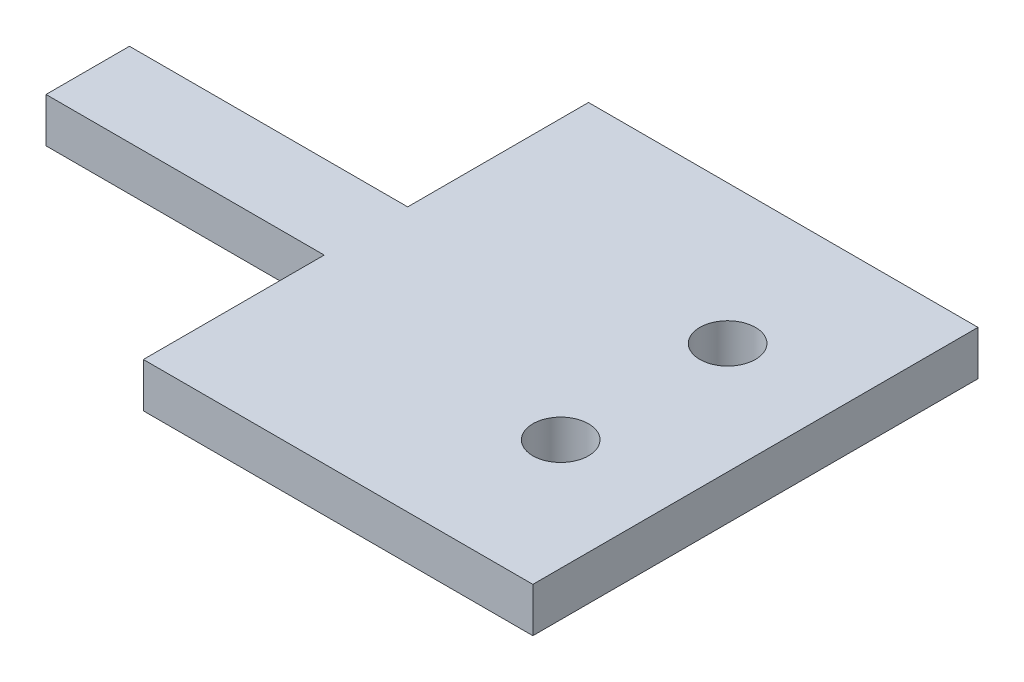
ISO-10303-21;
HEADER;
FILE_DESCRIPTION(('STEP AP214'),'2;1');
FILE_NAME('part.step','',(''),(''),'','','');
FILE_SCHEMA(('AUTOMOTIVE_DESIGN { 1 0 10303 214 1 1 1 1 }'));
ENDSEC;
DATA;
#1=APPLICATION_CONTEXT('core data for automotive mechanical design processes');
#2=APPLICATION_PROTOCOL_DEFINITION('international standard','automotive_design',2000,#1);
#3=PRODUCT_CONTEXT('',#1,'mechanical');
#4=PRODUCT('Part','Part','',(#3));
#5=PRODUCT_RELATED_PRODUCT_CATEGORY('part','',(#4));
#6=PRODUCT_DEFINITION_FORMATION('','',#4);
#7=PRODUCT_DEFINITION_CONTEXT('part definition',#1,'design');
#8=PRODUCT_DEFINITION('design','',#6,#7);
#9=PRODUCT_DEFINITION_SHAPE('','',#8);
#10=(LENGTH_UNIT() NAMED_UNIT(*) SI_UNIT(.MILLI.,.METRE.));
#11=(NAMED_UNIT(*) PLANE_ANGLE_UNIT() SI_UNIT($,.RADIAN.));
#12=(NAMED_UNIT(*) SI_UNIT($,.STERADIAN.) SOLID_ANGLE_UNIT());
#13=UNCERTAINTY_MEASURE_WITH_UNIT(LENGTH_MEASURE(1.E-05),#10,'distance_accuracy_value','');
#14=(GEOMETRIC_REPRESENTATION_CONTEXT(3) GLOBAL_UNCERTAINTY_ASSIGNED_CONTEXT((#13)) GLOBAL_UNIT_ASSIGNED_CONTEXT((#10,
#11,#12)) REPRESENTATION_CONTEXT('',''));
#15=CARTESIAN_POINT('',(0.,0.,0.));
#16=DIRECTION('',(0.,0.,1.));
#17=DIRECTION('',(1.,0.,0.));
#18=AXIS2_PLACEMENT_3D('',#15,#16,#17);
#19=CARTESIAN_POINT('',(0.,8.,0.));
#20=DIRECTION('',(0.,1.,0.));
#21=DIRECTION('',(0.,0.,1.));
#22=AXIS2_PLACEMENT_3D('',#19,#20,#21);
#23=PLANE('',#22);
#24=CARTESIAN_POINT('',(40.,8.,-15.));
#25=DIRECTION('',(0.,1.,0.));
#26=DIRECTION('',(0.,0.,1.));
#27=AXIS2_PLACEMENT_3D('',#24,#25,#26);
#28=CIRCLE('',#27,5.);
#29=CARTESIAN_POINT('',(40.,8.,-10.));
#30=VERTEX_POINT('',#29);
#31=EDGE_CURVE('E136',#30,#30,#28,.T.);
#32=ORIENTED_EDGE('',*,*,#31,.F.);
#33=EDGE_LOOP('',(#32));
#34=FACE_BOUND('',#33,.T.);
#35=DIRECTION('',(-1.,0.,0.));
#36=VECTOR('',#35,1.);
#37=CARTESIAN_POINT('',(-10.,8.,-40.));
#38=LINE('',#37,#36);
#39=CARTESIAN_POINT('',(60.,8.,-40.));
#40=VERTEX_POINT('',#39);
#41=CARTESIAN_POINT('',(-10.,8.,-40.));
#42=VERTEX_POINT('',#41);
#43=EDGE_CURVE('E147',#40,#42,#38,.T.);
#44=ORIENTED_EDGE('',*,*,#43,.T.);
#45=DIRECTION('',(0.,0.,1.));
#46=VECTOR('',#45,1.);
#47=CARTESIAN_POINT('',(-10.,8.,-7.5));
#48=LINE('',#47,#46);
#49=CARTESIAN_POINT('',(-10.,8.,-7.5));
#50=VERTEX_POINT('',#49);
#51=EDGE_CURVE('E95',#42,#50,#48,.T.);
#52=ORIENTED_EDGE('',*,*,#51,.T.);
#53=DIRECTION('',(-1.,0.,0.));
#54=VECTOR('',#53,1.);
#55=CARTESIAN_POINT('',(-60.,8.,-7.5));
#56=LINE('',#55,#54);
#57=CARTESIAN_POINT('',(-60.,8.,-7.5));
#58=VERTEX_POINT('',#57);
#59=EDGE_CURVE('E162',#50,#58,#56,.T.);
#60=ORIENTED_EDGE('',*,*,#59,.T.);
#61=DIRECTION('',(0.,0.,1.));
#62=VECTOR('',#61,1.);
#63=CARTESIAN_POINT('',(-60.,8.,-7.5));
#64=LINE('',#63,#62);
#65=CARTESIAN_POINT('',(-60.,8.,7.5));
#66=VERTEX_POINT('',#65);
#67=EDGE_CURVE('E175',#58,#66,#64,.T.);
#68=ORIENTED_EDGE('',*,*,#67,.T.);
#69=DIRECTION('',(1.,0.,0.));
#70=VECTOR('',#69,1.);
#71=CARTESIAN_POINT('',(-60.,8.,7.5));
#72=LINE('',#71,#70);
#73=CARTESIAN_POINT('',(-10.,8.,7.5));
#74=VERTEX_POINT('',#73);
#75=EDGE_CURVE('E114',#66,#74,#72,.T.);
#76=ORIENTED_EDGE('',*,*,#75,.T.);
#77=DIRECTION('',(0.,0.,1.));
#78=VECTOR('',#77,1.);
#79=CARTESIAN_POINT('',(-10.,8.,40.));
#80=LINE('',#79,#78);
#81=CARTESIAN_POINT('',(-10.,8.,40.));
#82=VERTEX_POINT('',#81);
#83=EDGE_CURVE('E108',#74,#82,#80,.T.);
#84=ORIENTED_EDGE('',*,*,#83,.T.);
#85=DIRECTION('',(1.,0.,0.));
#86=VECTOR('',#85,1.);
#87=CARTESIAN_POINT('',(60.,8.,40.));
#88=LINE('',#87,#86);
#89=CARTESIAN_POINT('',(60.,8.,40.));
#90=VERTEX_POINT('',#89);
#91=EDGE_CURVE('E112',#82,#90,#88,.T.);
#92=ORIENTED_EDGE('',*,*,#91,.T.);
#93=DIRECTION('',(0.,0.,-1.));
#94=VECTOR('',#93,1.);
#95=CARTESIAN_POINT('',(60.,8.,40.));
#96=LINE('',#95,#94);
#97=EDGE_CURVE('E52',#90,#40,#96,.T.);
#98=ORIENTED_EDGE('',*,*,#97,.T.);
#99=EDGE_LOOP('',(#44,#52,#60,#68,#76,#84,#92,#98));
#100=FACE_BOUND('',#99,.T.);
#101=CARTESIAN_POINT('',(40.,8.,15.));
#102=DIRECTION('',(0.,1.,0.));
#103=DIRECTION('',(0.,0.,1.));
#104=AXIS2_PLACEMENT_3D('',#101,#102,#103);
#105=CIRCLE('',#104,5.);
#106=CARTESIAN_POINT('',(40.,8.,20.));
#107=VERTEX_POINT('',#106);
#108=EDGE_CURVE('E184',#107,#107,#105,.T.);
#109=ORIENTED_EDGE('',*,*,#108,.F.);
#110=EDGE_LOOP('',(#109));
#111=FACE_BOUND('',#110,.T.);
#112=ADVANCED_FACE('F35',(#34,#100,#111),#23,.T.);
#113=CARTESIAN_POINT('',(0.,0.,0.));
#114=DIRECTION('',(0.,1.,0.));
#115=DIRECTION('',(0.,0.,1.));
#116=AXIS2_PLACEMENT_3D('',#113,#114,#115);
#117=PLANE('',#116);
#118=CARTESIAN_POINT('',(40.,0.,-15.));
#119=DIRECTION('',(0.,1.,0.));
#120=DIRECTION('',(0.,0.,1.));
#121=AXIS2_PLACEMENT_3D('',#118,#119,#120);
#122=CIRCLE('',#121,5.);
#123=CARTESIAN_POINT('',(40.,0.,-10.));
#124=VERTEX_POINT('',#123);
#125=EDGE_CURVE('E181',#124,#124,#122,.T.);
#126=ORIENTED_EDGE('',*,*,#125,.T.);
#127=EDGE_LOOP('',(#126));
#128=FACE_BOUND('',#127,.T.);
#129=DIRECTION('',(-1.,0.,0.));
#130=VECTOR('',#129,1.);
#131=CARTESIAN_POINT('',(-10.,0.,-40.));
#132=LINE('',#131,#130);
#133=CARTESIAN_POINT('',(60.,0.,-40.));
#134=VERTEX_POINT('',#133);
#135=CARTESIAN_POINT('',(-10.,0.,-40.));
#136=VERTEX_POINT('',#135);
#137=EDGE_CURVE('E132',#134,#136,#132,.T.);
#138=ORIENTED_EDGE('',*,*,#137,.F.);
#139=DIRECTION('',(0.,0.,-1.));
#140=VECTOR('',#139,1.);
#141=CARTESIAN_POINT('',(60.,0.,40.));
#142=LINE('',#141,#140);
#143=CARTESIAN_POINT('',(60.,0.,40.));
#144=VERTEX_POINT('',#143);
#145=EDGE_CURVE('E87',#144,#134,#142,.T.);
#146=ORIENTED_EDGE('',*,*,#145,.F.);
#147=DIRECTION('',(1.,0.,0.));
#148=VECTOR('',#147,1.);
#149=CARTESIAN_POINT('',(60.,0.,40.));
#150=LINE('',#149,#148);
#151=CARTESIAN_POINT('',(-10.,0.,40.));
#152=VERTEX_POINT('',#151);
#153=EDGE_CURVE('E81',#152,#144,#150,.T.);
#154=ORIENTED_EDGE('',*,*,#153,.F.);
#155=DIRECTION('',(0.,0.,1.));
#156=VECTOR('',#155,1.);
#157=CARTESIAN_POINT('',(-10.,0.,40.));
#158=LINE('',#157,#156);
#159=CARTESIAN_POINT('',(-10.,0.,7.5));
#160=VERTEX_POINT('',#159);
#161=EDGE_CURVE('E122',#160,#152,#158,.T.);
#162=ORIENTED_EDGE('',*,*,#161,.F.);
#163=DIRECTION('',(1.,0.,0.));
#164=VECTOR('',#163,1.);
#165=CARTESIAN_POINT('',(-60.,0.,7.5));
#166=LINE('',#165,#164);
#167=CARTESIAN_POINT('',(-60.,0.,7.5));
#168=VERTEX_POINT('',#167);
#169=EDGE_CURVE('E142',#168,#160,#166,.T.);
#170=ORIENTED_EDGE('',*,*,#169,.F.);
#171=DIRECTION('',(0.,0.,1.));
#172=VECTOR('',#171,1.);
#173=CARTESIAN_POINT('',(-60.,0.,-7.5));
#174=LINE('',#173,#172);
#175=CARTESIAN_POINT('',(-60.,0.,-7.5));
#176=VERTEX_POINT('',#175);
#177=EDGE_CURVE('E140',#176,#168,#174,.T.);
#178=ORIENTED_EDGE('',*,*,#177,.F.);
#179=DIRECTION('',(-1.,0.,0.));
#180=VECTOR('',#179,1.);
#181=CARTESIAN_POINT('',(-60.,0.,-7.5));
#182=LINE('',#181,#180);
#183=CARTESIAN_POINT('',(-10.,0.,-7.5));
#184=VERTEX_POINT('',#183);
#185=EDGE_CURVE('E138',#184,#176,#182,.T.);
#186=ORIENTED_EDGE('',*,*,#185,.F.);
#187=DIRECTION('',(0.,0.,1.));
#188=VECTOR('',#187,1.);
#189=CARTESIAN_POINT('',(-10.,0.,-7.5));
#190=LINE('',#189,#188);
#191=EDGE_CURVE('E135',#136,#184,#190,.T.);
#192=ORIENTED_EDGE('',*,*,#191,.F.);
#193=EDGE_LOOP('',(#138,#146,#154,#162,#170,#178,#186,#192));
#194=FACE_BOUND('',#193,.T.);
#195=CARTESIAN_POINT('',(40.,0.,15.));
#196=DIRECTION('',(0.,1.,0.));
#197=DIRECTION('',(0.,0.,1.));
#198=AXIS2_PLACEMENT_3D('',#195,#196,#197);
#199=CIRCLE('',#198,5.);
#200=CARTESIAN_POINT('',(40.,0.,20.));
#201=VERTEX_POINT('',#200);
#202=EDGE_CURVE('E187',#201,#201,#199,.T.);
#203=ORIENTED_EDGE('',*,*,#202,.T.);
#204=EDGE_LOOP('',(#203));
#205=FACE_BOUND('',#204,.T.);
#206=ADVANCED_FACE('F166',(#128,#194,#205),#117,.F.);
#207=CARTESIAN_POINT('',(-10.,8.,-40.));
#208=DIRECTION('',(0.,0.,1.));
#209=DIRECTION('',(1.,0.,0.));
#210=AXIS2_PLACEMENT_3D('',#207,#208,#209);
#211=PLANE('',#210);
#212=ORIENTED_EDGE('',*,*,#137,.T.);
#213=DIRECTION('',(0.,-1.,0.));
#214=VECTOR('',#213,1.);
#215=CARTESIAN_POINT('',(-10.,8.,-40.));
#216=LINE('',#215,#214);
#217=EDGE_CURVE('E11',#42,#136,#216,.T.);
#218=ORIENTED_EDGE('',*,*,#217,.F.);
#219=ORIENTED_EDGE('',*,*,#43,.F.);
#220=DIRECTION('',(0.,-1.,0.));
#221=VECTOR('',#220,1.);
#222=CARTESIAN_POINT('',(60.,8.,-40.));
#223=LINE('',#222,#221);
#224=EDGE_CURVE('E128',#40,#134,#223,.T.);
#225=ORIENTED_EDGE('',*,*,#224,.T.);
#226=EDGE_LOOP('',(#212,#218,#219,#225));
#227=FACE_BOUND('',#226,.T.);
#228=ADVANCED_FACE('F37',(#227),#211,.F.);
#229=CARTESIAN_POINT('',(-10.,8.,-7.5));
#230=DIRECTION('',(1.,0.,0.));
#231=DIRECTION('',(0.,0.,-1.));
#232=AXIS2_PLACEMENT_3D('',#229,#230,#231);
#233=PLANE('',#232);
#234=ORIENTED_EDGE('',*,*,#191,.T.);
#235=DIRECTION('',(0.,-1.,0.));
#236=VECTOR('',#235,1.);
#237=CARTESIAN_POINT('',(-10.,8.,-7.5));
#238=LINE('',#237,#236);
#239=EDGE_CURVE('E44',#50,#184,#238,.T.);
#240=ORIENTED_EDGE('',*,*,#239,.F.);
#241=ORIENTED_EDGE('',*,*,#51,.F.);
#242=ORIENTED_EDGE('',*,*,#217,.T.);
#243=EDGE_LOOP('',(#234,#240,#241,#242));
#244=FACE_BOUND('',#243,.T.);
#245=ADVANCED_FACE('F220',(#244),#233,.F.);
#246=CARTESIAN_POINT('',(-60.,8.,-7.5));
#247=DIRECTION('',(0.,0.,1.));
#248=DIRECTION('',(1.,0.,0.));
#249=AXIS2_PLACEMENT_3D('',#246,#247,#248);
#250=PLANE('',#249);
#251=ORIENTED_EDGE('',*,*,#185,.T.);
#252=DIRECTION('',(0.,-1.,0.));
#253=VECTOR('',#252,1.);
#254=CARTESIAN_POINT('',(-60.,8.,-7.5));
#255=LINE('',#254,#253);
#256=EDGE_CURVE('E154',#58,#176,#255,.T.);
#257=ORIENTED_EDGE('',*,*,#256,.F.);
#258=ORIENTED_EDGE('',*,*,#59,.F.);
#259=ORIENTED_EDGE('',*,*,#239,.T.);
#260=EDGE_LOOP('',(#251,#257,#258,#259));
#261=FACE_BOUND('',#260,.T.);
#262=ADVANCED_FACE('F160',(#261),#250,.F.);
#263=CARTESIAN_POINT('',(-60.,8.,-7.5));
#264=DIRECTION('',(1.,0.,0.));
#265=DIRECTION('',(0.,0.,-1.));
#266=AXIS2_PLACEMENT_3D('',#263,#264,#265);
#267=PLANE('',#266);
#268=ORIENTED_EDGE('',*,*,#177,.T.);
#269=DIRECTION('',(0.,-1.,0.));
#270=VECTOR('',#269,1.);
#271=CARTESIAN_POINT('',(-60.,8.,7.5));
#272=LINE('',#271,#270);
#273=EDGE_CURVE('E151',#66,#168,#272,.T.);
#274=ORIENTED_EDGE('',*,*,#273,.F.);
#275=ORIENTED_EDGE('',*,*,#67,.F.);
#276=ORIENTED_EDGE('',*,*,#256,.T.);
#277=EDGE_LOOP('',(#268,#274,#275,#276));
#278=FACE_BOUND('',#277,.T.);
#279=ADVANCED_FACE('F171',(#278),#267,.F.);
#280=CARTESIAN_POINT('',(-60.,8.,7.5));
#281=DIRECTION('',(0.,0.,-1.));
#282=DIRECTION('',(-1.,0.,0.));
#283=AXIS2_PLACEMENT_3D('',#280,#281,#282);
#284=PLANE('',#283);
#285=ORIENTED_EDGE('',*,*,#169,.T.);
#286=DIRECTION('',(0.,-1.,0.));
#287=VECTOR('',#286,1.);
#288=CARTESIAN_POINT('',(-10.,8.,7.5));
#289=LINE('',#288,#287);
#290=EDGE_CURVE('E123',#74,#160,#289,.T.);
#291=ORIENTED_EDGE('',*,*,#290,.F.);
#292=ORIENTED_EDGE('',*,*,#75,.F.);
#293=ORIENTED_EDGE('',*,*,#273,.T.);
#294=EDGE_LOOP('',(#285,#291,#292,#293));
#295=FACE_BOUND('',#294,.T.);
#296=ADVANCED_FACE('F174',(#295),#284,.F.);
#297=CARTESIAN_POINT('',(-10.,8.,40.));
#298=DIRECTION('',(1.,0.,0.));
#299=DIRECTION('',(0.,0.,-1.));
#300=AXIS2_PLACEMENT_3D('',#297,#298,#299);
#301=PLANE('',#300);
#302=ORIENTED_EDGE('',*,*,#161,.T.);
#303=DIRECTION('',(0.,-1.,0.));
#304=VECTOR('',#303,1.);
#305=CARTESIAN_POINT('',(-10.,8.,40.));
#306=LINE('',#305,#304);
#307=EDGE_CURVE('E119',#82,#152,#306,.T.);
#308=ORIENTED_EDGE('',*,*,#307,.F.);
#309=ORIENTED_EDGE('',*,*,#83,.F.);
#310=ORIENTED_EDGE('',*,*,#290,.T.);
#311=EDGE_LOOP('',(#302,#308,#309,#310));
#312=FACE_BOUND('',#311,.T.);
#313=ADVANCED_FACE('F120',(#312),#301,.F.);
#314=CARTESIAN_POINT('',(60.,8.,40.));
#315=DIRECTION('',(0.,0.,-1.));
#316=DIRECTION('',(-1.,0.,0.));
#317=AXIS2_PLACEMENT_3D('',#314,#315,#316);
#318=PLANE('',#317);
#319=ORIENTED_EDGE('',*,*,#153,.T.);
#320=DIRECTION('',(0.,-1.,0.));
#321=VECTOR('',#320,1.);
#322=CARTESIAN_POINT('',(60.,8.,40.));
#323=LINE('',#322,#321);
#324=EDGE_CURVE('E124',#90,#144,#323,.T.);
#325=ORIENTED_EDGE('',*,*,#324,.F.);
#326=ORIENTED_EDGE('',*,*,#91,.F.);
#327=ORIENTED_EDGE('',*,*,#307,.T.);
#328=EDGE_LOOP('',(#319,#325,#326,#327));
#329=FACE_BOUND('',#328,.T.);
#330=ADVANCED_FACE('F126',(#329),#318,.F.);
#331=CARTESIAN_POINT('',(60.,8.,40.));
#332=DIRECTION('',(-1.,0.,0.));
#333=DIRECTION('',(0.,0.,1.));
#334=AXIS2_PLACEMENT_3D('',#331,#332,#333);
#335=PLANE('',#334);
#336=ORIENTED_EDGE('',*,*,#145,.T.);
#337=ORIENTED_EDGE('',*,*,#224,.F.);
#338=ORIENTED_EDGE('',*,*,#97,.F.);
#339=ORIENTED_EDGE('',*,*,#324,.T.);
#340=EDGE_LOOP('',(#336,#337,#338,#339));
#341=FACE_BOUND('',#340,.T.);
#342=ADVANCED_FACE('F208',(#341),#335,.F.);
#343=CARTESIAN_POINT('',(40.,8.,-15.));
#344=DIRECTION('',(0.,-1.,0.));
#345=DIRECTION('',(0.,0.,-1.));
#346=AXIS2_PLACEMENT_3D('',#343,#344,#345);
#347=CYLINDRICAL_SURFACE('',#346,5.);
#348=ORIENTED_EDGE('',*,*,#31,.T.);
#349=EDGE_LOOP('',(#348));
#350=FACE_BOUND('',#349,.T.);
#351=ORIENTED_EDGE('',*,*,#125,.F.);
#352=EDGE_LOOP('',(#351));
#353=FACE_BOUND('',#352,.T.);
#354=ADVANCED_FACE('F205',(#350,#353),#347,.F.);
#355=CARTESIAN_POINT('',(40.,8.,15.));
#356=DIRECTION('',(0.,-1.,0.));
#357=DIRECTION('',(0.,0.,-1.));
#358=AXIS2_PLACEMENT_3D('',#355,#356,#357);
#359=CYLINDRICAL_SURFACE('',#358,5.);
#360=ORIENTED_EDGE('',*,*,#108,.T.);
#361=EDGE_LOOP('',(#360));
#362=FACE_BOUND('',#361,.T.);
#363=ORIENTED_EDGE('',*,*,#202,.F.);
#364=EDGE_LOOP('',(#363));
#365=FACE_BOUND('',#364,.T.);
#366=ADVANCED_FACE('F193',(#362,#365),#359,.F.);
#367=CLOSED_SHELL('',(#112,#206,#228,#245,#262,#279,#296,#313,#330,#342,#354,#366));
#368=MANIFOLD_SOLID_BREP('B2',#367);
#369=ADVANCED_BREP_SHAPE_REPRESENTATION('',(#18,#368),#14);
#370=SHAPE_DEFINITION_REPRESENTATION(#9,#369);
ENDSEC;
END-ISO-10303-21;
